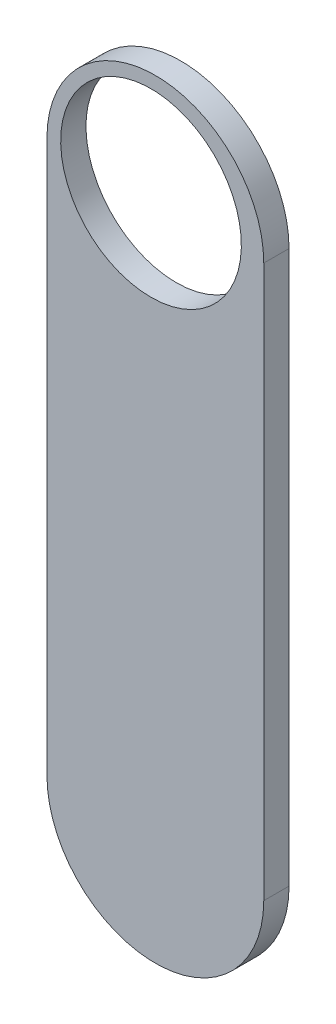
ISO-10303-21;
HEADER;
FILE_DESCRIPTION(('STEP AP214'),'2;1');
FILE_NAME('part.step','',(''),(''),'','','');
FILE_SCHEMA(('AUTOMOTIVE_DESIGN { 1 0 10303 214 1 1 1 1 }'));
ENDSEC;
DATA;
#1=APPLICATION_CONTEXT('core data for automotive mechanical design processes');
#2=APPLICATION_PROTOCOL_DEFINITION('international standard','automotive_design',2000,#1);
#3=PRODUCT_CONTEXT('',#1,'mechanical');
#4=PRODUCT('Part','Part','',(#3));
#5=PRODUCT_RELATED_PRODUCT_CATEGORY('part','',(#4));
#6=PRODUCT_DEFINITION_FORMATION('','',#4);
#7=PRODUCT_DEFINITION_CONTEXT('part definition',#1,'design');
#8=PRODUCT_DEFINITION('design','',#6,#7);
#9=PRODUCT_DEFINITION_SHAPE('','',#8);
#10=(LENGTH_UNIT() NAMED_UNIT(*) SI_UNIT(.MILLI.,.METRE.));
#11=(NAMED_UNIT(*) PLANE_ANGLE_UNIT() SI_UNIT($,.RADIAN.));
#12=(NAMED_UNIT(*) SI_UNIT($,.STERADIAN.) SOLID_ANGLE_UNIT());
#13=UNCERTAINTY_MEASURE_WITH_UNIT(LENGTH_MEASURE(1.E-05),#10,'distance_accuracy_value','');
#14=(GEOMETRIC_REPRESENTATION_CONTEXT(3) GLOBAL_UNCERTAINTY_ASSIGNED_CONTEXT((#13)) GLOBAL_UNIT_ASSIGNED_CONTEXT((#10,
#11,#12)) REPRESENTATION_CONTEXT('',''));
#15=CARTESIAN_POINT('',(0.,0.,0.));
#16=DIRECTION('',(0.,0.,1.));
#17=DIRECTION('',(1.,0.,0.));
#18=AXIS2_PLACEMENT_3D('',#15,#16,#17);
#19=CARTESIAN_POINT('',(135.79,-109.024,-0.045));
#20=DIRECTION('',(0.,0.,-1.));
#21=DIRECTION('',(0.,-1.,0.));
#22=AXIS2_PLACEMENT_3D('',#19,#20,#21);
#23=CYLINDRICAL_SURFACE('',#22,0.125);
#24=CARTESIAN_POINT('',(135.79,-109.024,1.6));
#25=DIRECTION('',(0.,0.,-1.));
#26=DIRECTION('',(0.,-1.,0.));
#27=AXIS2_PLACEMENT_3D('',#24,#25,#26);
#28=CIRCLE('',#27,0.125);
#29=CARTESIAN_POINT('',(135.79,-109.149,1.6));
#30=VERTEX_POINT('',#29);
#31=EDGE_CURVE('E125',#30,#30,#28,.T.);
#32=ORIENTED_EDGE('',*,*,#31,.T.);
#33=DIRECTION('',(0.,0.,1.));
#34=VECTOR('',#33,1.);
#35=CARTESIAN_POINT('',(135.79,-109.149,-0.045));
#36=LINE('',#35,#34);
#37=CARTESIAN_POINT('',(135.79,-109.149,1.635));
#38=VERTEX_POINT('',#37);
#39=EDGE_CURVE('E11',#30,#38,#36,.T.);
#40=ORIENTED_EDGE('',*,*,#39,.T.);
#41=CARTESIAN_POINT('',(135.79,-109.024,1.635));
#42=DIRECTION('',(0.,0.,-1.));
#43=DIRECTION('',(0.,-1.,0.));
#44=AXIS2_PLACEMENT_3D('',#41,#42,#43);
#45=CIRCLE('',#44,0.125);
#46=EDGE_CURVE('E25',#38,#38,#45,.T.);
#47=ORIENTED_EDGE('',*,*,#46,.F.);
#48=ORIENTED_EDGE('',*,*,#39,.F.);
#49=EDGE_LOOP('',(#32,#40,#47,#48));
#50=FACE_BOUND('',#49,.T.);
#51=ADVANCED_FACE('F17',(#50),#23,.F.);
#52=CARTESIAN_POINT('',(135.646,-109.03,1.6));
#53=DIRECTION('',(1.,0.,0.));
#54=DIRECTION('',(0.,1.,0.));
#55=AXIS2_PLACEMENT_3D('',#52,#53,#54);
#56=PLANE('',#55);
#57=DIRECTION('',(0.,-1.,0.));
#58=VECTOR('',#57,1.);
#59=CARTESIAN_POINT('',(135.646,-109.03,1.6));
#60=LINE('',#59,#58);
#61=CARTESIAN_POINT('',(135.646,-109.03,1.6));
#62=VERTEX_POINT('',#61);
#63=CARTESIAN_POINT('',(135.646,-109.794,1.6));
#64=VERTEX_POINT('',#63);
#65=EDGE_CURVE('E81',#62,#64,#60,.T.);
#66=ORIENTED_EDGE('',*,*,#65,.T.);
#67=DIRECTION('',(0.,0.,1.));
#68=VECTOR('',#67,1.);
#69=CARTESIAN_POINT('',(135.646,-109.794,1.6));
#70=LINE('',#69,#68);
#71=CARTESIAN_POINT('',(135.646,-109.794,1.635));
#72=VERTEX_POINT('',#71);
#73=EDGE_CURVE('E87',#64,#72,#70,.T.);
#74=ORIENTED_EDGE('',*,*,#73,.T.);
#75=DIRECTION('',(0.,-1.,0.));
#76=VECTOR('',#75,1.);
#77=CARTESIAN_POINT('',(135.646,-109.03,1.635));
#78=LINE('',#77,#76);
#79=CARTESIAN_POINT('',(135.646,-109.03,1.635));
#80=VERTEX_POINT('',#79);
#81=EDGE_CURVE('E132',#80,#72,#78,.T.);
#82=ORIENTED_EDGE('',*,*,#81,.F.);
#83=DIRECTION('',(0.,0.,1.));
#84=VECTOR('',#83,1.);
#85=CARTESIAN_POINT('',(135.646,-109.03,1.6));
#86=LINE('',#85,#84);
#87=EDGE_CURVE('E86',#62,#80,#86,.T.);
#88=ORIENTED_EDGE('',*,*,#87,.F.);
#89=EDGE_LOOP('',(#66,#74,#82,#88));
#90=FACE_BOUND('',#89,.T.);
#91=ADVANCED_FACE('F142',(#90),#56,.F.);
#92=CARTESIAN_POINT('',(135.946,-109.794,1.635));
#93=DIRECTION('',(0.,0.,1.));
#94=DIRECTION('',(1.,0.,0.));
#95=AXIS2_PLACEMENT_3D('',#92,#93,#94);
#96=PLANE('',#95);
#97=ORIENTED_EDGE('',*,*,#46,.T.);
#98=EDGE_LOOP('',(#97));
#99=FACE_BOUND('',#98,.T.);
#100=DIRECTION('',(0.,1.,0.));
#101=VECTOR('',#100,1.);
#102=CARTESIAN_POINT('',(135.946,-109.794,1.635));
#103=LINE('',#102,#101);
#104=CARTESIAN_POINT('',(135.946,-109.794,1.635));
#105=VERTEX_POINT('',#104);
#106=CARTESIAN_POINT('',(135.946,-109.03,1.635));
#107=VERTEX_POINT('',#106);
#108=EDGE_CURVE('E98',#105,#107,#103,.T.);
#109=ORIENTED_EDGE('',*,*,#108,.T.);
#110=CARTESIAN_POINT('',(135.796,-109.03,1.635));
#111=DIRECTION('',(0.,0.,1.));
#112=DIRECTION('',(1.,0.,0.));
#113=AXIS2_PLACEMENT_3D('',#110,#111,#112);
#114=CIRCLE('',#113,0.15);
#115=EDGE_CURVE('E93',#107,#80,#114,.T.);
#116=ORIENTED_EDGE('',*,*,#115,.T.);
#117=ORIENTED_EDGE('',*,*,#81,.T.);
#118=CARTESIAN_POINT('',(135.796,-109.794,1.635));
#119=DIRECTION('',(0.,0.,1.));
#120=DIRECTION('',(-1.,0.,0.));
#121=AXIS2_PLACEMENT_3D('',#118,#119,#120);
#122=CIRCLE('',#121,0.15);
#123=EDGE_CURVE('E117',#72,#105,#122,.T.);
#124=ORIENTED_EDGE('',*,*,#123,.T.);
#125=EDGE_LOOP('',(#109,#116,#117,#124));
#126=FACE_BOUND('',#125,.T.);
#127=ADVANCED_FACE('F138',(#99,#126),#96,.T.);
#128=CARTESIAN_POINT('',(135.946,-109.794,1.6));
#129=DIRECTION('',(0.,0.,1.));
#130=DIRECTION('',(1.,0.,0.));
#131=AXIS2_PLACEMENT_3D('',#128,#129,#130);
#132=PLANE('',#131);
#133=ORIENTED_EDGE('',*,*,#31,.F.);
#134=EDGE_LOOP('',(#133));
#135=FACE_BOUND('',#134,.T.);
#136=CARTESIAN_POINT('',(135.796,-109.794,1.6));
#137=DIRECTION('',(0.,0.,1.));
#138=DIRECTION('',(-1.,0.,0.));
#139=AXIS2_PLACEMENT_3D('',#136,#137,#138);
#140=CIRCLE('',#139,0.15);
#141=CARTESIAN_POINT('',(135.946,-109.794,1.6));
#142=VERTEX_POINT('',#141);
#143=EDGE_CURVE('E114',#64,#142,#140,.T.);
#144=ORIENTED_EDGE('',*,*,#143,.F.);
#145=ORIENTED_EDGE('',*,*,#65,.F.);
#146=CARTESIAN_POINT('',(135.796,-109.03,1.6));
#147=DIRECTION('',(0.,0.,1.));
#148=DIRECTION('',(1.,0.,0.));
#149=AXIS2_PLACEMENT_3D('',#146,#147,#148);
#150=CIRCLE('',#149,0.15);
#151=CARTESIAN_POINT('',(135.946,-109.03,1.6));
#152=VERTEX_POINT('',#151);
#153=EDGE_CURVE('E75',#152,#62,#150,.T.);
#154=ORIENTED_EDGE('',*,*,#153,.F.);
#155=DIRECTION('',(0.,1.,0.));
#156=VECTOR('',#155,1.);
#157=CARTESIAN_POINT('',(135.946,-109.794,1.6));
#158=LINE('',#157,#156);
#159=EDGE_CURVE('E80',#142,#152,#158,.T.);
#160=ORIENTED_EDGE('',*,*,#159,.F.);
#161=EDGE_LOOP('',(#144,#145,#154,#160));
#162=FACE_BOUND('',#161,.T.);
#163=ADVANCED_FACE('F78',(#135,#162),#132,.F.);
#164=CARTESIAN_POINT('',(135.796,-109.03,1.6));
#165=DIRECTION('',(0.,0.,-1.));
#166=DIRECTION('',(1.,0.,0.));
#167=AXIS2_PLACEMENT_3D('',#164,#165,#166);
#168=CYLINDRICAL_SURFACE('',#167,0.15);
#169=ORIENTED_EDGE('',*,*,#153,.T.);
#170=ORIENTED_EDGE('',*,*,#87,.T.);
#171=ORIENTED_EDGE('',*,*,#115,.F.);
#172=DIRECTION('',(0.,0.,1.));
#173=VECTOR('',#172,1.);
#174=CARTESIAN_POINT('',(135.946,-109.03,1.6));
#175=LINE('',#174,#173);
#176=EDGE_CURVE('E90',#152,#107,#175,.T.);
#177=ORIENTED_EDGE('',*,*,#176,.F.);
#178=EDGE_LOOP('',(#169,#170,#171,#177));
#179=FACE_BOUND('',#178,.T.);
#180=ADVANCED_FACE('F91',(#179),#168,.T.);
#181=CARTESIAN_POINT('',(135.796,-109.794,1.6));
#182=DIRECTION('',(0.,0.,-1.));
#183=DIRECTION('',(-1.,0.,0.));
#184=AXIS2_PLACEMENT_3D('',#181,#182,#183);
#185=CYLINDRICAL_SURFACE('',#184,0.15);
#186=ORIENTED_EDGE('',*,*,#143,.T.);
#187=DIRECTION('',(0.,0.,1.));
#188=VECTOR('',#187,1.);
#189=CARTESIAN_POINT('',(135.946,-109.794,1.6));
#190=LINE('',#189,#188);
#191=EDGE_CURVE('E103',#142,#105,#190,.T.);
#192=ORIENTED_EDGE('',*,*,#191,.T.);
#193=ORIENTED_EDGE('',*,*,#123,.F.);
#194=ORIENTED_EDGE('',*,*,#73,.F.);
#195=EDGE_LOOP('',(#186,#192,#193,#194));
#196=FACE_BOUND('',#195,.T.);
#197=ADVANCED_FACE('F160',(#196),#185,.T.);
#198=CARTESIAN_POINT('',(135.946,-109.794,1.6));
#199=DIRECTION('',(-1.,0.,0.));
#200=DIRECTION('',(0.,0.,1.));
#201=AXIS2_PLACEMENT_3D('',#198,#199,#200);
#202=PLANE('',#201);
#203=ORIENTED_EDGE('',*,*,#159,.T.);
#204=ORIENTED_EDGE('',*,*,#176,.T.);
#205=ORIENTED_EDGE('',*,*,#108,.F.);
#206=ORIENTED_EDGE('',*,*,#191,.F.);
#207=EDGE_LOOP('',(#203,#204,#205,#206));
#208=FACE_BOUND('',#207,.T.);
#209=ADVANCED_FACE('F101',(#208),#202,.F.);
#210=CLOSED_SHELL('',(#51,#91,#127,#163,#180,#197,#209));
#211=MANIFOLD_SOLID_BREP('B1',#210);
#212=ADVANCED_BREP_SHAPE_REPRESENTATION('',(#18,#211),#14);
#213=SHAPE_DEFINITION_REPRESENTATION(#9,#212);
ENDSEC;
END-ISO-10303-21;
